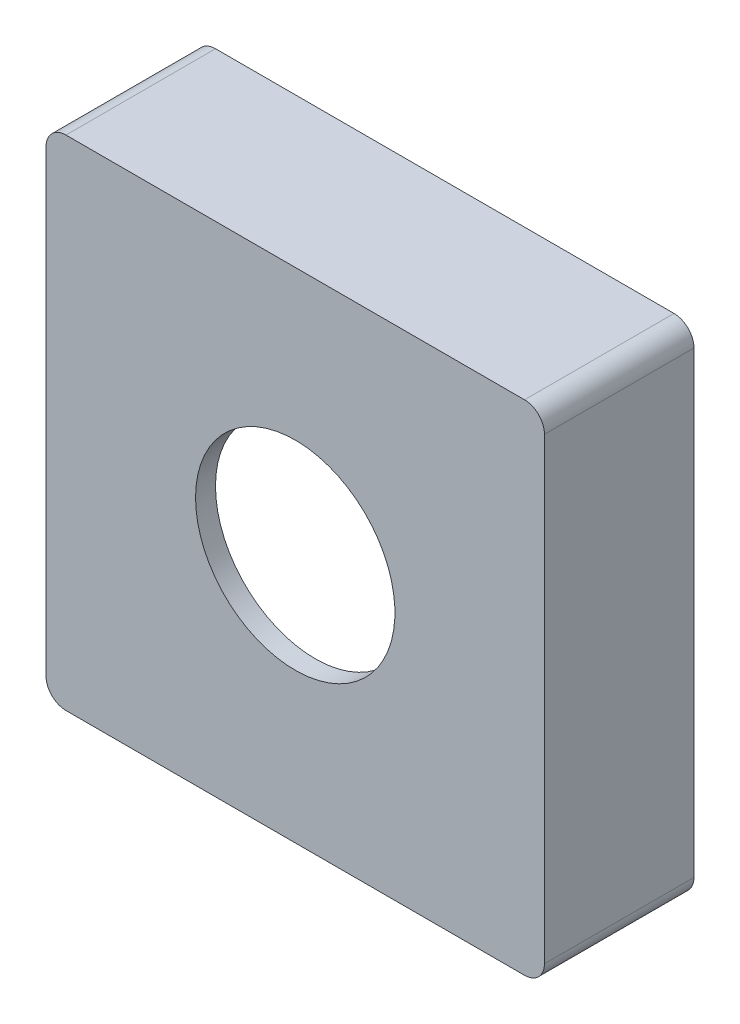
ISO-10303-21;
HEADER;
FILE_DESCRIPTION(('STEP AP214'),'2;1');
FILE_NAME('part.step','',(''),(''),'','','');
FILE_SCHEMA(('AUTOMOTIVE_DESIGN { 1 0 10303 214 1 1 1 1 }'));
ENDSEC;
DATA;
#1=APPLICATION_CONTEXT('core data for automotive mechanical design processes');
#2=APPLICATION_PROTOCOL_DEFINITION('international standard','automotive_design',2000,#1);
#3=PRODUCT_CONTEXT('',#1,'mechanical');
#4=PRODUCT('Part','Part','',(#3));
#5=PRODUCT_RELATED_PRODUCT_CATEGORY('part','',(#4));
#6=PRODUCT_DEFINITION_FORMATION('','',#4);
#7=PRODUCT_DEFINITION_CONTEXT('part definition',#1,'design');
#8=PRODUCT_DEFINITION('design','',#6,#7);
#9=PRODUCT_DEFINITION_SHAPE('','',#8);
#10=(LENGTH_UNIT() NAMED_UNIT(*) SI_UNIT(.MILLI.,.METRE.));
#11=(NAMED_UNIT(*) PLANE_ANGLE_UNIT() SI_UNIT($,.RADIAN.));
#12=(NAMED_UNIT(*) SI_UNIT($,.STERADIAN.) SOLID_ANGLE_UNIT());
#13=UNCERTAINTY_MEASURE_WITH_UNIT(LENGTH_MEASURE(1.E-05),#10,'distance_accuracy_value','');
#14=(GEOMETRIC_REPRESENTATION_CONTEXT(3) GLOBAL_UNCERTAINTY_ASSIGNED_CONTEXT((#13)) GLOBAL_UNIT_ASSIGNED_CONTEXT((#10,
#11,#12)) REPRESENTATION_CONTEXT('',''));
#15=CARTESIAN_POINT('',(0.,0.,0.));
#16=DIRECTION('',(0.,0.,1.));
#17=DIRECTION('',(1.,0.,0.));
#18=AXIS2_PLACEMENT_3D('',#15,#16,#17);
#19=CARTESIAN_POINT('',(0.,0.,0.));
#20=DIRECTION('',(0.,0.,-1.));
#21=DIRECTION('',(-1.,0.,0.));
#22=AXIS2_PLACEMENT_3D('',#19,#20,#21);
#23=PLANE('',#22);
#24=DIRECTION('',(1.,0.,0.));
#25=VECTOR('',#24,1.);
#26=CARTESIAN_POINT('',(25.,-25.,0.));
#27=LINE('',#26,#25);
#28=CARTESIAN_POINT('',(-23.,-25.,0.));
#29=VERTEX_POINT('',#28);
#30=CARTESIAN_POINT('',(23.,-25.,0.));
#31=VERTEX_POINT('',#30);
#32=EDGE_CURVE('E356',#29,#31,#27,.T.);
#33=ORIENTED_EDGE('',*,*,#32,.F.);
#34=CARTESIAN_POINT('',(-23.,-23.,0.));
#35=DIRECTION('',(0.,0.,-1.));
#36=DIRECTION('',(-1.,0.,0.));
#37=AXIS2_PLACEMENT_3D('',#34,#35,#36);
#38=CIRCLE('',#37,2.);
#39=CARTESIAN_POINT('',(-25.,-23.,0.));
#40=VERTEX_POINT('',#39);
#41=EDGE_CURVE('E229',#29,#40,#38,.T.);
#42=ORIENTED_EDGE('',*,*,#41,.T.);
#43=DIRECTION('',(0.,-1.,0.));
#44=VECTOR('',#43,1.);
#45=CARTESIAN_POINT('',(-25.,-25.,0.));
#46=LINE('',#45,#44);
#47=CARTESIAN_POINT('',(-25.,23.,0.));
#48=VERTEX_POINT('',#47);
#49=EDGE_CURVE('E362',#48,#40,#46,.T.);
#50=ORIENTED_EDGE('',*,*,#49,.F.);
#51=CARTESIAN_POINT('',(-23.,23.,0.));
#52=DIRECTION('',(0.,0.,-1.));
#53=DIRECTION('',(-1.,0.,0.));
#54=AXIS2_PLACEMENT_3D('',#51,#52,#53);
#55=CIRCLE('',#54,2.);
#56=CARTESIAN_POINT('',(-23.,25.,0.));
#57=VERTEX_POINT('',#56);
#58=EDGE_CURVE('E227',#48,#57,#55,.T.);
#59=ORIENTED_EDGE('',*,*,#58,.T.);
#60=DIRECTION('',(-1.,0.,0.));
#61=VECTOR('',#60,1.);
#62=CARTESIAN_POINT('',(25.,25.,0.));
#63=LINE('',#62,#61);
#64=CARTESIAN_POINT('',(23.,25.,0.));
#65=VERTEX_POINT('',#64);
#66=EDGE_CURVE('E360',#65,#57,#63,.T.);
#67=ORIENTED_EDGE('',*,*,#66,.F.);
#68=CARTESIAN_POINT('',(23.,23.,0.));
#69=DIRECTION('',(0.,0.,-1.));
#70=DIRECTION('',(-1.,0.,0.));
#71=AXIS2_PLACEMENT_3D('',#68,#69,#70);
#72=CIRCLE('',#71,2.);
#73=CARTESIAN_POINT('',(25.,23.,0.));
#74=VERTEX_POINT('',#73);
#75=EDGE_CURVE('E225',#65,#74,#72,.T.);
#76=ORIENTED_EDGE('',*,*,#75,.T.);
#77=DIRECTION('',(0.,1.,0.));
#78=VECTOR('',#77,1.);
#79=CARTESIAN_POINT('',(25.,-25.,0.));
#80=LINE('',#79,#78);
#81=CARTESIAN_POINT('',(25.,-23.,0.));
#82=VERTEX_POINT('',#81);
#83=EDGE_CURVE('E353',#82,#74,#80,.T.);
#84=ORIENTED_EDGE('',*,*,#83,.F.);
#85=CARTESIAN_POINT('',(23.,-23.,0.));
#86=DIRECTION('',(0.,0.,-1.));
#87=DIRECTION('',(-1.,0.,0.));
#88=AXIS2_PLACEMENT_3D('',#85,#86,#87);
#89=CIRCLE('',#88,2.);
#90=EDGE_CURVE('E223',#82,#31,#89,.T.);
#91=ORIENTED_EDGE('',*,*,#90,.T.);
#92=EDGE_LOOP('',(#33,#42,#50,#59,#67,#76,#84,#91));
#93=FACE_BOUND('',#92,.T.);
#94=DIRECTION('',(1.,0.,0.));
#95=VECTOR('',#94,1.);
#96=CARTESIAN_POINT('',(0.,-23.,0.));
#97=LINE('',#96,#95);
#98=CARTESIAN_POINT('',(-21.,-23.,0.));
#99=VERTEX_POINT('',#98);
#100=CARTESIAN_POINT('',(21.,-23.,0.));
#101=VERTEX_POINT('',#100);
#102=EDGE_CURVE('E179',#99,#101,#97,.T.);
#103=ORIENTED_EDGE('',*,*,#102,.T.);
#104=CARTESIAN_POINT('',(21.,-21.,0.));
#105=DIRECTION('',(0.,0.,-1.));
#106=DIRECTION('',(-1.,0.,0.));
#107=AXIS2_PLACEMENT_3D('',#104,#105,#106);
#108=CIRCLE('',#107,2.);
#109=CARTESIAN_POINT('',(23.,-21.,0.));
#110=VERTEX_POINT('',#109);
#111=EDGE_CURVE('E168',#101,#110,#108,.F.);
#112=ORIENTED_EDGE('',*,*,#111,.T.);
#113=DIRECTION('',(0.,1.,0.));
#114=VECTOR('',#113,1.);
#115=CARTESIAN_POINT('',(23.,0.,0.));
#116=LINE('',#115,#114);
#117=CARTESIAN_POINT('',(23.,21.,0.));
#118=VERTEX_POINT('',#117);
#119=EDGE_CURVE('E390',#110,#118,#116,.T.);
#120=ORIENTED_EDGE('',*,*,#119,.T.);
#121=CARTESIAN_POINT('',(21.,21.,0.));
#122=DIRECTION('',(0.,0.,-1.));
#123=DIRECTION('',(-1.,0.,0.));
#124=AXIS2_PLACEMENT_3D('',#121,#122,#123);
#125=CIRCLE('',#124,2.);
#126=CARTESIAN_POINT('',(21.,23.,0.));
#127=VERTEX_POINT('',#126);
#128=EDGE_CURVE('E216',#118,#127,#125,.F.);
#129=ORIENTED_EDGE('',*,*,#128,.T.);
#130=DIRECTION('',(-1.,0.,0.));
#131=VECTOR('',#130,1.);
#132=CARTESIAN_POINT('',(0.,23.,0.));
#133=LINE('',#132,#131);
#134=CARTESIAN_POINT('',(-21.,23.,0.));
#135=VERTEX_POINT('',#134);
#136=EDGE_CURVE('E163',#127,#135,#133,.T.);
#137=ORIENTED_EDGE('',*,*,#136,.T.);
#138=CARTESIAN_POINT('',(-21.,21.,0.));
#139=DIRECTION('',(0.,0.,-1.));
#140=DIRECTION('',(-1.,0.,0.));
#141=AXIS2_PLACEMENT_3D('',#138,#139,#140);
#142=CIRCLE('',#141,2.);
#143=CARTESIAN_POINT('',(-23.,21.,0.));
#144=VERTEX_POINT('',#143);
#145=EDGE_CURVE('E158',#135,#144,#142,.F.);
#146=ORIENTED_EDGE('',*,*,#145,.T.);
#147=DIRECTION('',(0.,-1.,0.));
#148=VECTOR('',#147,1.);
#149=CARTESIAN_POINT('',(-23.,0.,0.));
#150=LINE('',#149,#148);
#151=CARTESIAN_POINT('',(-23.,-21.,0.));
#152=VERTEX_POINT('',#151);
#153=EDGE_CURVE('E161',#144,#152,#150,.T.);
#154=ORIENTED_EDGE('',*,*,#153,.T.);
#155=CARTESIAN_POINT('',(-21.,-21.,0.));
#156=DIRECTION('',(0.,0.,-1.));
#157=DIRECTION('',(-1.,0.,0.));
#158=AXIS2_PLACEMENT_3D('',#155,#156,#157);
#159=CIRCLE('',#158,2.);
#160=EDGE_CURVE('E169',#152,#99,#159,.F.);
#161=ORIENTED_EDGE('',*,*,#160,.T.);
#162=EDGE_LOOP('',(#103,#112,#120,#129,#137,#146,#154,#161));
#163=FACE_BOUND('',#162,.T.);
#164=ADVANCED_FACE('F43',(#93,#163),#23,.T.);
#165=CARTESIAN_POINT('',(25.,25.,15.));
#166=DIRECTION('',(0.,-1.,0.));
#167=DIRECTION('',(0.,0.,-1.));
#168=AXIS2_PLACEMENT_3D('',#165,#166,#167);
#169=PLANE('',#168);
#170=ORIENTED_EDGE('',*,*,#66,.T.);
#171=DIRECTION('',(0.,0.,-1.));
#172=VECTOR('',#171,1.);
#173=CARTESIAN_POINT('',(-23.,25.,15.));
#174=LINE('',#173,#172);
#175=CARTESIAN_POINT('',(-23.,25.,15.));
#176=VERTEX_POINT('',#175);
#177=EDGE_CURVE('E246',#57,#176,#174,.F.);
#178=ORIENTED_EDGE('',*,*,#177,.T.);
#179=DIRECTION('',(-1.,0.,0.));
#180=VECTOR('',#179,1.);
#181=CARTESIAN_POINT('',(25.,25.,15.));
#182=LINE('',#181,#180);
#183=CARTESIAN_POINT('',(23.,25.,15.));
#184=VERTEX_POINT('',#183);
#185=EDGE_CURVE('E347',#184,#176,#182,.T.);
#186=ORIENTED_EDGE('',*,*,#185,.F.);
#187=DIRECTION('',(0.,0.,-1.));
#188=VECTOR('',#187,1.);
#189=CARTESIAN_POINT('',(23.,25.,15.));
#190=LINE('',#189,#188);
#191=EDGE_CURVE('E243',#184,#65,#190,.T.);
#192=ORIENTED_EDGE('',*,*,#191,.T.);
#193=EDGE_LOOP('',(#170,#178,#186,#192));
#194=FACE_BOUND('',#193,.T.);
#195=ADVANCED_FACE('F290',(#194),#169,.F.);
#196=CARTESIAN_POINT('',(-25.,-25.,15.));
#197=DIRECTION('',(1.,0.,0.));
#198=DIRECTION('',(0.,0.,-1.));
#199=AXIS2_PLACEMENT_3D('',#196,#197,#198);
#200=PLANE('',#199);
#201=ORIENTED_EDGE('',*,*,#49,.T.);
#202=DIRECTION('',(0.,0.,-1.));
#203=VECTOR('',#202,1.);
#204=CARTESIAN_POINT('',(-25.,-23.,15.));
#205=LINE('',#204,#203);
#206=CARTESIAN_POINT('',(-25.,-23.,15.));
#207=VERTEX_POINT('',#206);
#208=EDGE_CURVE('E234',#40,#207,#205,.F.);
#209=ORIENTED_EDGE('',*,*,#208,.T.);
#210=DIRECTION('',(0.,-1.,0.));
#211=VECTOR('',#210,1.);
#212=CARTESIAN_POINT('',(-25.,-25.,15.));
#213=LINE('',#212,#211);
#214=CARTESIAN_POINT('',(-25.,23.,15.));
#215=VERTEX_POINT('',#214);
#216=EDGE_CURVE('E352',#215,#207,#213,.T.);
#217=ORIENTED_EDGE('',*,*,#216,.F.);
#218=DIRECTION('',(0.,0.,-1.));
#219=VECTOR('',#218,1.);
#220=CARTESIAN_POINT('',(-25.,23.,15.));
#221=LINE('',#220,#219);
#222=EDGE_CURVE('E231',#215,#48,#221,.T.);
#223=ORIENTED_EDGE('',*,*,#222,.T.);
#224=EDGE_LOOP('',(#201,#209,#217,#223));
#225=FACE_BOUND('',#224,.T.);
#226=ADVANCED_FACE('F297',(#225),#200,.F.);
#227=CARTESIAN_POINT('',(25.,-25.,15.));
#228=DIRECTION('',(0.,1.,0.));
#229=DIRECTION('',(0.,0.,1.));
#230=AXIS2_PLACEMENT_3D('',#227,#228,#229);
#231=PLANE('',#230);
#232=DIRECTION('',(1.,0.,0.));
#233=VECTOR('',#232,1.);
#234=CARTESIAN_POINT('',(25.,-25.,15.));
#235=LINE('',#234,#233);
#236=CARTESIAN_POINT('',(-23.,-25.,15.));
#237=VERTEX_POINT('',#236);
#238=CARTESIAN_POINT('',(23.,-25.,15.));
#239=VERTEX_POINT('',#238);
#240=EDGE_CURVE('E188',#237,#239,#235,.T.);
#241=ORIENTED_EDGE('',*,*,#240,.F.);
#242=DIRECTION('',(0.,0.,-1.));
#243=VECTOR('',#242,1.);
#244=CARTESIAN_POINT('',(-23.,-25.,15.));
#245=LINE('',#244,#243);
#246=EDGE_CURVE('E220',#237,#29,#245,.T.);
#247=ORIENTED_EDGE('',*,*,#246,.T.);
#248=ORIENTED_EDGE('',*,*,#32,.T.);
#249=DIRECTION('',(0.,0.,-1.));
#250=VECTOR('',#249,1.);
#251=CARTESIAN_POINT('',(23.,-25.,15.));
#252=LINE('',#251,#250);
#253=EDGE_CURVE('E218',#31,#239,#252,.F.);
#254=ORIENTED_EDGE('',*,*,#253,.T.);
#255=EDGE_LOOP('',(#241,#247,#248,#254));
#256=FACE_BOUND('',#255,.T.);
#257=ADVANCED_FACE('F306',(#256),#231,.F.);
#258=CARTESIAN_POINT('',(25.,-25.,15.));
#259=DIRECTION('',(-1.,0.,0.));
#260=DIRECTION('',(0.,0.,1.));
#261=AXIS2_PLACEMENT_3D('',#258,#259,#260);
#262=PLANE('',#261);
#263=ORIENTED_EDGE('',*,*,#83,.T.);
#264=DIRECTION('',(0.,0.,-1.));
#265=VECTOR('',#264,1.);
#266=CARTESIAN_POINT('',(25.,23.,15.));
#267=LINE('',#266,#265);
#268=CARTESIAN_POINT('',(25.,23.,15.));
#269=VERTEX_POINT('',#268);
#270=EDGE_CURVE('E58',#74,#269,#267,.F.);
#271=ORIENTED_EDGE('',*,*,#270,.T.);
#272=DIRECTION('',(0.,1.,0.));
#273=VECTOR('',#272,1.);
#274=CARTESIAN_POINT('',(25.,-25.,15.));
#275=LINE('',#274,#273);
#276=CARTESIAN_POINT('',(25.,-23.,15.));
#277=VERTEX_POINT('',#276);
#278=EDGE_CURVE('E184',#277,#269,#275,.T.);
#279=ORIENTED_EDGE('',*,*,#278,.F.);
#280=DIRECTION('',(0.,0.,-1.));
#281=VECTOR('',#280,1.);
#282=CARTESIAN_POINT('',(25.,-23.,15.));
#283=LINE('',#282,#281);
#284=EDGE_CURVE('E248',#277,#82,#283,.T.);
#285=ORIENTED_EDGE('',*,*,#284,.T.);
#286=EDGE_LOOP('',(#263,#271,#279,#285));
#287=FACE_BOUND('',#286,.T.);
#288=ADVANCED_FACE('F303',(#287),#262,.F.);
#289=CARTESIAN_POINT('',(0.,0.,15.));
#290=DIRECTION('',(0.,0.,-1.));
#291=DIRECTION('',(-1.,0.,0.));
#292=AXIS2_PLACEMENT_3D('',#289,#290,#291);
#293=PLANE('',#292);
#294=CARTESIAN_POINT('',(0.,0.,15.));
#295=DIRECTION('',(0.,0.,-1.));
#296=DIRECTION('',(-1.,0.,0.));
#297=AXIS2_PLACEMENT_3D('',#294,#295,#296);
#298=CIRCLE('',#297,10.);
#299=CARTESIAN_POINT('',(-10.,0.,15.));
#300=VERTEX_POINT('',#299);
#301=EDGE_CURVE('E389',#300,#300,#298,.T.);
#302=ORIENTED_EDGE('',*,*,#301,.T.);
#303=EDGE_LOOP('',(#302));
#304=FACE_BOUND('',#303,.T.);
#305=ORIENTED_EDGE('',*,*,#216,.T.);
#306=CARTESIAN_POINT('',(-23.,-23.,15.));
#307=DIRECTION('',(0.,0.,-1.));
#308=DIRECTION('',(-1.,0.,0.));
#309=AXIS2_PLACEMENT_3D('',#306,#307,#308);
#310=CIRCLE('',#309,2.);
#311=EDGE_CURVE('E241',#207,#237,#310,.F.);
#312=ORIENTED_EDGE('',*,*,#311,.T.);
#313=ORIENTED_EDGE('',*,*,#240,.T.);
#314=CARTESIAN_POINT('',(23.,-23.,15.));
#315=DIRECTION('',(0.,0.,-1.));
#316=DIRECTION('',(-1.,0.,0.));
#317=AXIS2_PLACEMENT_3D('',#314,#315,#316);
#318=CIRCLE('',#317,2.);
#319=EDGE_CURVE('E65',#239,#277,#318,.F.);
#320=ORIENTED_EDGE('',*,*,#319,.T.);
#321=ORIENTED_EDGE('',*,*,#278,.T.);
#322=CARTESIAN_POINT('',(23.,23.,15.));
#323=DIRECTION('',(0.,0.,-1.));
#324=DIRECTION('',(-1.,0.,0.));
#325=AXIS2_PLACEMENT_3D('',#322,#323,#324);
#326=CIRCLE('',#325,2.);
#327=EDGE_CURVE('E237',#269,#184,#326,.F.);
#328=ORIENTED_EDGE('',*,*,#327,.T.);
#329=ORIENTED_EDGE('',*,*,#185,.T.);
#330=CARTESIAN_POINT('',(-23.,23.,15.));
#331=DIRECTION('',(0.,0.,-1.));
#332=DIRECTION('',(-1.,0.,0.));
#333=AXIS2_PLACEMENT_3D('',#330,#331,#332);
#334=CIRCLE('',#333,2.);
#335=EDGE_CURVE('E239',#176,#215,#334,.F.);
#336=ORIENTED_EDGE('',*,*,#335,.T.);
#337=EDGE_LOOP('',(#305,#312,#313,#320,#321,#328,#329,#336));
#338=FACE_BOUND('',#337,.T.);
#339=ADVANCED_FACE('F302',(#304,#338),#293,.F.);
#340=CARTESIAN_POINT('',(25.,23.,15.));
#341=DIRECTION('',(0.,-1.,0.));
#342=DIRECTION('',(0.,0.,-1.));
#343=AXIS2_PLACEMENT_3D('',#340,#341,#342);
#344=PLANE('',#343);
#345=DIRECTION('',(-1.,0.,0.));
#346=VECTOR('',#345,1.);
#347=CARTESIAN_POINT('',(0.,23.,13.));
#348=LINE('',#347,#346);
#349=CARTESIAN_POINT('',(21.,23.,13.));
#350=VERTEX_POINT('',#349);
#351=CARTESIAN_POINT('',(-21.,23.,13.));
#352=VERTEX_POINT('',#351);
#353=EDGE_CURVE('E392',#350,#352,#348,.T.);
#354=ORIENTED_EDGE('',*,*,#353,.T.);
#355=DIRECTION('',(0.,0.,-1.));
#356=VECTOR('',#355,1.);
#357=CARTESIAN_POINT('',(-21.,23.,0.));
#358=LINE('',#357,#356);
#359=EDGE_CURVE('E207',#352,#135,#358,.T.);
#360=ORIENTED_EDGE('',*,*,#359,.T.);
#361=ORIENTED_EDGE('',*,*,#136,.F.);
#362=DIRECTION('',(0.,0.,-1.));
#363=VECTOR('',#362,1.);
#364=CARTESIAN_POINT('',(21.,23.,13.));
#365=LINE('',#364,#363);
#366=EDGE_CURVE('E205',#127,#350,#365,.F.);
#367=ORIENTED_EDGE('',*,*,#366,.T.);
#368=EDGE_LOOP('',(#354,#360,#361,#367));
#369=FACE_BOUND('',#368,.T.);
#370=ADVANCED_FACE('F486',(#369),#344,.T.);
#371=CARTESIAN_POINT('',(-23.,-25.,15.));
#372=DIRECTION('',(1.,0.,0.));
#373=DIRECTION('',(0.,0.,-1.));
#374=AXIS2_PLACEMENT_3D('',#371,#372,#373);
#375=PLANE('',#374);
#376=DIRECTION('',(0.,-1.,0.));
#377=VECTOR('',#376,1.);
#378=CARTESIAN_POINT('',(-23.,0.,13.));
#379=LINE('',#378,#377);
#380=CARTESIAN_POINT('',(-23.,21.,13.));
#381=VERTEX_POINT('',#380);
#382=CARTESIAN_POINT('',(-23.,-21.,13.));
#383=VERTEX_POINT('',#382);
#384=EDGE_CURVE('E384',#381,#383,#379,.T.);
#385=ORIENTED_EDGE('',*,*,#384,.T.);
#386=DIRECTION('',(0.,0.,-1.));
#387=VECTOR('',#386,1.);
#388=CARTESIAN_POINT('',(-23.,-21.,0.));
#389=LINE('',#388,#387);
#390=EDGE_CURVE('E178',#383,#152,#389,.T.);
#391=ORIENTED_EDGE('',*,*,#390,.T.);
#392=ORIENTED_EDGE('',*,*,#153,.F.);
#393=DIRECTION('',(0.,0.,-1.));
#394=VECTOR('',#393,1.);
#395=CARTESIAN_POINT('',(-23.,21.,13.));
#396=LINE('',#395,#394);
#397=EDGE_CURVE('E175',#144,#381,#396,.F.);
#398=ORIENTED_EDGE('',*,*,#397,.T.);
#399=EDGE_LOOP('',(#385,#391,#392,#398));
#400=FACE_BOUND('',#399,.T.);
#401=ADVANCED_FACE('F174',(#400),#375,.T.);
#402=CARTESIAN_POINT('',(25.,-23.,15.));
#403=DIRECTION('',(0.,1.,0.));
#404=DIRECTION('',(0.,0.,1.));
#405=AXIS2_PLACEMENT_3D('',#402,#403,#404);
#406=PLANE('',#405);
#407=ORIENTED_EDGE('',*,*,#102,.F.);
#408=DIRECTION('',(0.,0.,-1.));
#409=VECTOR('',#408,1.);
#410=CARTESIAN_POINT('',(-21.,-23.,13.));
#411=LINE('',#410,#409);
#412=CARTESIAN_POINT('',(-21.,-23.,13.));
#413=VERTEX_POINT('',#412);
#414=EDGE_CURVE('E196',#99,#413,#411,.F.);
#415=ORIENTED_EDGE('',*,*,#414,.T.);
#416=DIRECTION('',(1.,0.,0.));
#417=VECTOR('',#416,1.);
#418=CARTESIAN_POINT('',(0.,-23.,13.));
#419=LINE('',#418,#417);
#420=CARTESIAN_POINT('',(21.,-23.,13.));
#421=VERTEX_POINT('',#420);
#422=EDGE_CURVE('E378',#413,#421,#419,.T.);
#423=ORIENTED_EDGE('',*,*,#422,.T.);
#424=DIRECTION('',(0.,0.,-1.));
#425=VECTOR('',#424,1.);
#426=CARTESIAN_POINT('',(21.,-23.,0.));
#427=LINE('',#426,#425);
#428=EDGE_CURVE('E186',#421,#101,#427,.T.);
#429=ORIENTED_EDGE('',*,*,#428,.T.);
#430=EDGE_LOOP('',(#407,#415,#423,#429));
#431=FACE_BOUND('',#430,.T.);
#432=ADVANCED_FACE('F397',(#431),#406,.T.);
#433=CARTESIAN_POINT('',(23.,-25.,15.));
#434=DIRECTION('',(-1.,0.,0.));
#435=DIRECTION('',(0.,0.,1.));
#436=AXIS2_PLACEMENT_3D('',#433,#434,#435);
#437=PLANE('',#436);
#438=ORIENTED_EDGE('',*,*,#119,.F.);
#439=DIRECTION('',(0.,0.,-1.));
#440=VECTOR('',#439,1.);
#441=CARTESIAN_POINT('',(23.,-21.,13.));
#442=LINE('',#441,#440);
#443=CARTESIAN_POINT('',(23.,-21.,13.));
#444=VERTEX_POINT('',#443);
#445=EDGE_CURVE('E212',#110,#444,#442,.F.);
#446=ORIENTED_EDGE('',*,*,#445,.T.);
#447=DIRECTION('',(0.,1.,0.));
#448=VECTOR('',#447,1.);
#449=CARTESIAN_POINT('',(23.,0.,13.));
#450=LINE('',#449,#448);
#451=CARTESIAN_POINT('',(23.,21.,13.));
#452=VERTEX_POINT('',#451);
#453=EDGE_CURVE('E363',#444,#452,#450,.T.);
#454=ORIENTED_EDGE('',*,*,#453,.T.);
#455=DIRECTION('',(0.,0.,-1.));
#456=VECTOR('',#455,1.);
#457=CARTESIAN_POINT('',(23.,21.,0.));
#458=LINE('',#457,#456);
#459=EDGE_CURVE('E209',#452,#118,#458,.T.);
#460=ORIENTED_EDGE('',*,*,#459,.T.);
#461=EDGE_LOOP('',(#438,#446,#454,#460));
#462=FACE_BOUND('',#461,.T.);
#463=ADVANCED_FACE('F493',(#462),#437,.T.);
#464=CARTESIAN_POINT('',(0.,0.,13.));
#465=DIRECTION('',(0.,0.,-1.));
#466=DIRECTION('',(-1.,0.,0.));
#467=AXIS2_PLACEMENT_3D('',#464,#465,#466);
#468=PLANE('',#467);
#469=CARTESIAN_POINT('',(-17.5,-10.,13.));
#470=DIRECTION('',(0.,0.,-1.));
#471=DIRECTION('',(-1.,0.,0.));
#472=AXIS2_PLACEMENT_3D('',#469,#470,#471);
#473=CIRCLE('',#472,2.5);
#474=CARTESIAN_POINT('',(-20.,-10.,13.));
#475=VERTEX_POINT('',#474);
#476=EDGE_CURVE('E436',#475,#475,#473,.T.);
#477=ORIENTED_EDGE('',*,*,#476,.F.);
#478=EDGE_LOOP('',(#477));
#479=FACE_BOUND('',#478,.T.);
#480=CARTESIAN_POINT('',(17.5,10.,13.));
#481=DIRECTION('',(0.,0.,-1.));
#482=DIRECTION('',(-1.,0.,0.));
#483=AXIS2_PLACEMENT_3D('',#480,#481,#482);
#484=CIRCLE('',#483,2.5);
#485=CARTESIAN_POINT('',(15.,10.,13.));
#486=VERTEX_POINT('',#485);
#487=EDGE_CURVE('E427',#486,#486,#484,.T.);
#488=ORIENTED_EDGE('',*,*,#487,.F.);
#489=EDGE_LOOP('',(#488));
#490=FACE_BOUND('',#489,.T.);
#491=CARTESIAN_POINT('',(-17.5,10.,13.));
#492=DIRECTION('',(0.,0.,-1.));
#493=DIRECTION('',(-1.,0.,0.));
#494=AXIS2_PLACEMENT_3D('',#491,#492,#493);
#495=CIRCLE('',#494,2.5);
#496=CARTESIAN_POINT('',(-20.,10.,13.));
#497=VERTEX_POINT('',#496);
#498=EDGE_CURVE('E417',#497,#497,#495,.T.);
#499=ORIENTED_EDGE('',*,*,#498,.F.);
#500=EDGE_LOOP('',(#499));
#501=FACE_BOUND('',#500,.T.);
#502=CARTESIAN_POINT('',(17.5,-10.,13.));
#503=DIRECTION('',(0.,0.,-1.));
#504=DIRECTION('',(-1.,0.,0.));
#505=AXIS2_PLACEMENT_3D('',#502,#503,#504);
#506=CIRCLE('',#505,2.5);
#507=CARTESIAN_POINT('',(15.,-10.,13.));
#508=VERTEX_POINT('',#507);
#509=EDGE_CURVE('E407',#508,#508,#506,.T.);
#510=ORIENTED_EDGE('',*,*,#509,.F.);
#511=EDGE_LOOP('',(#510));
#512=FACE_BOUND('',#511,.T.);
#513=CARTESIAN_POINT('',(0.,0.,13.));
#514=DIRECTION('',(0.,0.,-1.));
#515=DIRECTION('',(-1.,0.,0.));
#516=AXIS2_PLACEMENT_3D('',#513,#514,#515);
#517=CIRCLE('',#516,10.);
#518=CARTESIAN_POINT('',(-10.,0.,13.));
#519=VERTEX_POINT('',#518);
#520=EDGE_CURVE('E191',#519,#519,#517,.T.);
#521=ORIENTED_EDGE('',*,*,#520,.F.);
#522=EDGE_LOOP('',(#521));
#523=FACE_BOUND('',#522,.T.);
#524=ORIENTED_EDGE('',*,*,#422,.F.);
#525=CARTESIAN_POINT('',(-21.,-21.,13.));
#526=DIRECTION('',(0.,0.,-1.));
#527=DIRECTION('',(-1.,0.,0.));
#528=AXIS2_PLACEMENT_3D('',#525,#526,#527);
#529=CIRCLE('',#528,2.);
#530=EDGE_CURVE('E203',#413,#383,#529,.T.);
#531=ORIENTED_EDGE('',*,*,#530,.T.);
#532=ORIENTED_EDGE('',*,*,#384,.F.);
#533=CARTESIAN_POINT('',(-21.,21.,13.));
#534=DIRECTION('',(0.,0.,-1.));
#535=DIRECTION('',(-1.,0.,0.));
#536=AXIS2_PLACEMENT_3D('',#533,#534,#535);
#537=CIRCLE('',#536,2.);
#538=EDGE_CURVE('E183',#381,#352,#537,.T.);
#539=ORIENTED_EDGE('',*,*,#538,.T.);
#540=ORIENTED_EDGE('',*,*,#353,.F.);
#541=CARTESIAN_POINT('',(21.,21.,13.));
#542=DIRECTION('',(0.,0.,-1.));
#543=DIRECTION('',(-1.,0.,0.));
#544=AXIS2_PLACEMENT_3D('',#541,#542,#543);
#545=CIRCLE('',#544,2.);
#546=EDGE_CURVE('E198',#350,#452,#545,.T.);
#547=ORIENTED_EDGE('',*,*,#546,.T.);
#548=ORIENTED_EDGE('',*,*,#453,.F.);
#549=CARTESIAN_POINT('',(21.,-21.,13.));
#550=DIRECTION('',(0.,0.,-1.));
#551=DIRECTION('',(-1.,0.,0.));
#552=AXIS2_PLACEMENT_3D('',#549,#550,#551);
#553=CIRCLE('',#552,2.);
#554=EDGE_CURVE('E200',#444,#421,#553,.T.);
#555=ORIENTED_EDGE('',*,*,#554,.T.);
#556=EDGE_LOOP('',(#524,#531,#532,#539,#540,#547,#548,#555));
#557=FACE_BOUND('',#556,.T.);
#558=ADVANCED_FACE('F278',(#479,#490,#501,#512,#523,#557),#468,.T.);
#559=CARTESIAN_POINT('',(0.,0.,0.));
#560=DIRECTION('',(0.,0.,1.));
#561=DIRECTION('',(1.,0.,0.));
#562=AXIS2_PLACEMENT_3D('',#559,#560,#561);
#563=CYLINDRICAL_SURFACE('',#562,10.);
#564=ORIENTED_EDGE('',*,*,#520,.T.);
#565=EDGE_LOOP('',(#564));
#566=FACE_BOUND('',#565,.T.);
#567=ORIENTED_EDGE('',*,*,#301,.F.);
#568=EDGE_LOOP('',(#567));
#569=FACE_BOUND('',#568,.T.);
#570=ADVANCED_FACE('F316',(#566,#569),#563,.F.);
#571=CARTESIAN_POINT('',(-21.,-21.,15.));
#572=DIRECTION('',(0.,0.,1.));
#573=DIRECTION('',(1.,0.,0.));
#574=AXIS2_PLACEMENT_3D('',#571,#572,#573);
#575=CYLINDRICAL_SURFACE('',#574,2.);
#576=ORIENTED_EDGE('',*,*,#530,.F.);
#577=ORIENTED_EDGE('',*,*,#414,.F.);
#578=ORIENTED_EDGE('',*,*,#160,.F.);
#579=ORIENTED_EDGE('',*,*,#390,.F.);
#580=EDGE_LOOP('',(#576,#577,#578,#579));
#581=FACE_BOUND('',#580,.T.);
#582=ADVANCED_FACE('F313',(#581),#575,.F.);
#583=CARTESIAN_POINT('',(-21.,21.,15.));
#584=DIRECTION('',(0.,0.,1.));
#585=DIRECTION('',(1.,0.,0.));
#586=AXIS2_PLACEMENT_3D('',#583,#584,#585);
#587=CYLINDRICAL_SURFACE('',#586,2.);
#588=ORIENTED_EDGE('',*,*,#538,.F.);
#589=ORIENTED_EDGE('',*,*,#397,.F.);
#590=ORIENTED_EDGE('',*,*,#145,.F.);
#591=ORIENTED_EDGE('',*,*,#359,.F.);
#592=EDGE_LOOP('',(#588,#589,#590,#591));
#593=FACE_BOUND('',#592,.T.);
#594=ADVANCED_FACE('F182',(#593),#587,.F.);
#595=CARTESIAN_POINT('',(21.,-21.,15.));
#596=DIRECTION('',(0.,0.,1.));
#597=DIRECTION('',(1.,0.,0.));
#598=AXIS2_PLACEMENT_3D('',#595,#596,#597);
#599=CYLINDRICAL_SURFACE('',#598,2.);
#600=ORIENTED_EDGE('',*,*,#554,.F.);
#601=ORIENTED_EDGE('',*,*,#445,.F.);
#602=ORIENTED_EDGE('',*,*,#111,.F.);
#603=ORIENTED_EDGE('',*,*,#428,.F.);
#604=EDGE_LOOP('',(#600,#601,#602,#603));
#605=FACE_BOUND('',#604,.T.);
#606=ADVANCED_FACE('F320',(#605),#599,.F.);
#607=CARTESIAN_POINT('',(21.,21.,15.));
#608=DIRECTION('',(0.,0.,1.));
#609=DIRECTION('',(1.,0.,0.));
#610=AXIS2_PLACEMENT_3D('',#607,#608,#609);
#611=CYLINDRICAL_SURFACE('',#610,2.);
#612=ORIENTED_EDGE('',*,*,#546,.F.);
#613=ORIENTED_EDGE('',*,*,#366,.F.);
#614=ORIENTED_EDGE('',*,*,#128,.F.);
#615=ORIENTED_EDGE('',*,*,#459,.F.);
#616=EDGE_LOOP('',(#612,#613,#614,#615));
#617=FACE_BOUND('',#616,.T.);
#618=ADVANCED_FACE('F323',(#617),#611,.F.);
#619=CARTESIAN_POINT('',(-23.,-23.,15.));
#620=DIRECTION('',(0.,0.,-1.));
#621=DIRECTION('',(-1.,0.,0.));
#622=AXIS2_PLACEMENT_3D('',#619,#620,#621);
#623=CYLINDRICAL_SURFACE('',#622,2.);
#624=ORIENTED_EDGE('',*,*,#311,.F.);
#625=ORIENTED_EDGE('',*,*,#208,.F.);
#626=ORIENTED_EDGE('',*,*,#41,.F.);
#627=ORIENTED_EDGE('',*,*,#246,.F.);
#628=EDGE_LOOP('',(#624,#625,#626,#627));
#629=FACE_BOUND('',#628,.T.);
#630=ADVANCED_FACE('F326',(#629),#623,.T.);
#631=CARTESIAN_POINT('',(-23.,23.,15.));
#632=DIRECTION('',(0.,0.,-1.));
#633=DIRECTION('',(-1.,0.,0.));
#634=AXIS2_PLACEMENT_3D('',#631,#632,#633);
#635=CYLINDRICAL_SURFACE('',#634,2.);
#636=ORIENTED_EDGE('',*,*,#335,.F.);
#637=ORIENTED_EDGE('',*,*,#177,.F.);
#638=ORIENTED_EDGE('',*,*,#58,.F.);
#639=ORIENTED_EDGE('',*,*,#222,.F.);
#640=EDGE_LOOP('',(#636,#637,#638,#639));
#641=FACE_BOUND('',#640,.T.);
#642=ADVANCED_FACE('F330',(#641),#635,.T.);
#643=CARTESIAN_POINT('',(23.,23.,15.));
#644=DIRECTION('',(0.,0.,-1.));
#645=DIRECTION('',(-1.,0.,0.));
#646=AXIS2_PLACEMENT_3D('',#643,#644,#645);
#647=CYLINDRICAL_SURFACE('',#646,2.);
#648=ORIENTED_EDGE('',*,*,#327,.F.);
#649=ORIENTED_EDGE('',*,*,#270,.F.);
#650=ORIENTED_EDGE('',*,*,#75,.F.);
#651=ORIENTED_EDGE('',*,*,#191,.F.);
#652=EDGE_LOOP('',(#648,#649,#650,#651));
#653=FACE_BOUND('',#652,.T.);
#654=ADVANCED_FACE('F333',(#653),#647,.T.);
#655=CARTESIAN_POINT('',(23.,-23.,15.));
#656=DIRECTION('',(0.,0.,-1.));
#657=DIRECTION('',(-1.,0.,0.));
#658=AXIS2_PLACEMENT_3D('',#655,#656,#657);
#659=CYLINDRICAL_SURFACE('',#658,2.);
#660=ORIENTED_EDGE('',*,*,#319,.F.);
#661=ORIENTED_EDGE('',*,*,#253,.F.);
#662=ORIENTED_EDGE('',*,*,#90,.F.);
#663=ORIENTED_EDGE('',*,*,#284,.F.);
#664=EDGE_LOOP('',(#660,#661,#662,#663));
#665=FACE_BOUND('',#664,.T.);
#666=ADVANCED_FACE('F45',(#665),#659,.T.);
#667=CARTESIAN_POINT('',(17.5,-10.,10.));
#668=DIRECTION('',(0.,0.,-1.));
#669=DIRECTION('',(-1.,0.,0.));
#670=AXIS2_PLACEMENT_3D('',#667,#668,#669);
#671=PLANE('',#670);
#672=CARTESIAN_POINT('',(17.5,-10.,10.));
#673=DIRECTION('',(0.,0.,-1.));
#674=DIRECTION('',(-1.,0.,0.));
#675=AXIS2_PLACEMENT_3D('',#672,#673,#674);
#676=CIRCLE('',#675,2.5);
#677=CARTESIAN_POINT('',(15.,-10.,10.));
#678=VERTEX_POINT('',#677);
#679=EDGE_CURVE('E410',#678,#678,#676,.T.);
#680=ORIENTED_EDGE('',*,*,#679,.T.);
#681=EDGE_LOOP('',(#680));
#682=FACE_BOUND('',#681,.T.);
#683=CARTESIAN_POINT('',(17.5,-10.,10.));
#684=DIRECTION('',(0.,0.,-1.));
#685=DIRECTION('',(-1.,0.,0.));
#686=AXIS2_PLACEMENT_3D('',#683,#684,#685);
#687=CIRCLE('',#686,1.5);
#688=CARTESIAN_POINT('',(16.,-10.,10.));
#689=VERTEX_POINT('',#688);
#690=EDGE_CURVE('E411',#689,#689,#687,.T.);
#691=ORIENTED_EDGE('',*,*,#690,.F.);
#692=EDGE_LOOP('',(#691));
#693=FACE_BOUND('',#692,.T.);
#694=ADVANCED_FACE('F340',(#682,#693),#671,.T.);
#695=CARTESIAN_POINT('',(17.5,-10.,10.));
#696=DIRECTION('',(0.,0.,1.));
#697=DIRECTION('',(1.,0.,0.));
#698=AXIS2_PLACEMENT_3D('',#695,#696,#697);
#699=CYLINDRICAL_SURFACE('',#698,2.5);
#700=ORIENTED_EDGE('',*,*,#679,.F.);
#701=EDGE_LOOP('',(#700));
#702=FACE_BOUND('',#701,.T.);
#703=ORIENTED_EDGE('',*,*,#509,.T.);
#704=EDGE_LOOP('',(#703));
#705=FACE_BOUND('',#704,.T.);
#706=ADVANCED_FACE('F475',(#702,#705),#699,.T.);
#707=CARTESIAN_POINT('',(17.5,-10.,10.));
#708=DIRECTION('',(0.,0.,1.));
#709=DIRECTION('',(1.,0.,0.));
#710=AXIS2_PLACEMENT_3D('',#707,#708,#709);
#711=CYLINDRICAL_SURFACE('',#710,1.5);
#712=ORIENTED_EDGE('',*,*,#690,.T.);
#713=EDGE_LOOP('',(#712));
#714=FACE_BOUND('',#713,.T.);
#715=CARTESIAN_POINT('',(17.5,-10.,13.));
#716=DIRECTION('',(0.,0.,-1.));
#717=DIRECTION('',(-1.,0.,0.));
#718=AXIS2_PLACEMENT_3D('',#715,#716,#717);
#719=CIRCLE('',#718,1.5);
#720=CARTESIAN_POINT('',(16.,-10.,13.));
#721=VERTEX_POINT('',#720);
#722=EDGE_CURVE('E252',#721,#721,#719,.F.);
#723=ORIENTED_EDGE('',*,*,#722,.T.);
#724=EDGE_LOOP('',(#723));
#725=FACE_BOUND('',#724,.T.);
#726=ADVANCED_FACE('F472',(#714,#725),#711,.F.);
#727=ORIENTED_EDGE('',*,*,#722,.F.);
#728=EDGE_LOOP('',(#727));
#729=FACE_BOUND('',#728,.T.);
#730=ADVANCED_FACE('F285',(#729),#468,.T.);
#731=CARTESIAN_POINT('',(-17.5,10.,10.));
#732=DIRECTION('',(0.,0.,-1.));
#733=DIRECTION('',(-1.,0.,0.));
#734=AXIS2_PLACEMENT_3D('',#731,#732,#733);
#735=PLANE('',#734);
#736=CARTESIAN_POINT('',(-17.5,10.,10.));
#737=DIRECTION('',(0.,0.,-1.));
#738=DIRECTION('',(-1.,0.,0.));
#739=AXIS2_PLACEMENT_3D('',#736,#737,#738);
#740=CIRCLE('',#739,2.5);
#741=CARTESIAN_POINT('',(-20.,10.,10.));
#742=VERTEX_POINT('',#741);
#743=EDGE_CURVE('E420',#742,#742,#740,.T.);
#744=ORIENTED_EDGE('',*,*,#743,.T.);
#745=EDGE_LOOP('',(#744));
#746=FACE_BOUND('',#745,.T.);
#747=CARTESIAN_POINT('',(-17.5,10.,10.));
#748=DIRECTION('',(0.,0.,-1.));
#749=DIRECTION('',(-1.,0.,0.));
#750=AXIS2_PLACEMENT_3D('',#747,#748,#749);
#751=CIRCLE('',#750,1.5);
#752=CARTESIAN_POINT('',(-19.,10.,10.));
#753=VERTEX_POINT('',#752);
#754=EDGE_CURVE('E421',#753,#753,#751,.T.);
#755=ORIENTED_EDGE('',*,*,#754,.F.);
#756=EDGE_LOOP('',(#755));
#757=FACE_BOUND('',#756,.T.);
#758=ADVANCED_FACE('F465',(#746,#757),#735,.T.);
#759=CARTESIAN_POINT('',(-17.5,10.,10.));
#760=DIRECTION('',(0.,0.,1.));
#761=DIRECTION('',(1.,0.,0.));
#762=AXIS2_PLACEMENT_3D('',#759,#760,#761);
#763=CYLINDRICAL_SURFACE('',#762,2.5);
#764=ORIENTED_EDGE('',*,*,#743,.F.);
#765=EDGE_LOOP('',(#764));
#766=FACE_BOUND('',#765,.T.);
#767=ORIENTED_EDGE('',*,*,#498,.T.);
#768=EDGE_LOOP('',(#767));
#769=FACE_BOUND('',#768,.T.);
#770=ADVANCED_FACE('F463',(#766,#769),#763,.T.);
#771=CARTESIAN_POINT('',(-17.5,10.,10.));
#772=DIRECTION('',(0.,0.,1.));
#773=DIRECTION('',(1.,0.,0.));
#774=AXIS2_PLACEMENT_3D('',#771,#772,#773);
#775=CYLINDRICAL_SURFACE('',#774,1.5);
#776=ORIENTED_EDGE('',*,*,#754,.T.);
#777=EDGE_LOOP('',(#776));
#778=FACE_BOUND('',#777,.T.);
#779=CARTESIAN_POINT('',(-17.5,10.,13.));
#780=DIRECTION('',(0.,0.,-1.));
#781=DIRECTION('',(-1.,0.,0.));
#782=AXIS2_PLACEMENT_3D('',#779,#780,#781);
#783=CIRCLE('',#782,1.5);
#784=CARTESIAN_POINT('',(-19.,10.,13.));
#785=VERTEX_POINT('',#784);
#786=EDGE_CURVE('E255',#785,#785,#783,.F.);
#787=ORIENTED_EDGE('',*,*,#786,.T.);
#788=EDGE_LOOP('',(#787));
#789=FACE_BOUND('',#788,.T.);
#790=ADVANCED_FACE('F283',(#778,#789),#775,.F.);
#791=ORIENTED_EDGE('',*,*,#786,.F.);
#792=EDGE_LOOP('',(#791));
#793=FACE_BOUND('',#792,.T.);
#794=ADVANCED_FACE('F266',(#793),#468,.T.);
#795=CARTESIAN_POINT('',(17.5,10.,10.));
#796=DIRECTION('',(0.,0.,-1.));
#797=DIRECTION('',(-1.,0.,0.));
#798=AXIS2_PLACEMENT_3D('',#795,#796,#797);
#799=PLANE('',#798);
#800=CARTESIAN_POINT('',(17.5,10.,10.));
#801=DIRECTION('',(0.,0.,-1.));
#802=DIRECTION('',(-1.,0.,0.));
#803=AXIS2_PLACEMENT_3D('',#800,#801,#802);
#804=CIRCLE('',#803,2.5);
#805=CARTESIAN_POINT('',(15.,10.,10.));
#806=VERTEX_POINT('',#805);
#807=EDGE_CURVE('E430',#806,#806,#804,.T.);
#808=ORIENTED_EDGE('',*,*,#807,.T.);
#809=EDGE_LOOP('',(#808));
#810=FACE_BOUND('',#809,.T.);
#811=CARTESIAN_POINT('',(17.5,10.,10.));
#812=DIRECTION('',(0.,0.,-1.));
#813=DIRECTION('',(-1.,0.,0.));
#814=AXIS2_PLACEMENT_3D('',#811,#812,#813);
#815=CIRCLE('',#814,1.5);
#816=CARTESIAN_POINT('',(16.,10.,10.));
#817=VERTEX_POINT('',#816);
#818=EDGE_CURVE('E424',#817,#817,#815,.T.);
#819=ORIENTED_EDGE('',*,*,#818,.F.);
#820=EDGE_LOOP('',(#819));
#821=FACE_BOUND('',#820,.T.);
#822=ADVANCED_FACE('F282',(#810,#821),#799,.T.);
#823=CARTESIAN_POINT('',(17.5,10.,10.));
#824=DIRECTION('',(0.,0.,1.));
#825=DIRECTION('',(1.,0.,0.));
#826=AXIS2_PLACEMENT_3D('',#823,#824,#825);
#827=CYLINDRICAL_SURFACE('',#826,2.5);
#828=ORIENTED_EDGE('',*,*,#807,.F.);
#829=EDGE_LOOP('',(#828));
#830=FACE_BOUND('',#829,.T.);
#831=ORIENTED_EDGE('',*,*,#487,.T.);
#832=EDGE_LOOP('',(#831));
#833=FACE_BOUND('',#832,.T.);
#834=ADVANCED_FACE('F275',(#830,#833),#827,.T.);
#835=CARTESIAN_POINT('',(17.5,10.,10.));
#836=DIRECTION('',(0.,0.,1.));
#837=DIRECTION('',(1.,0.,0.));
#838=AXIS2_PLACEMENT_3D('',#835,#836,#837);
#839=CYLINDRICAL_SURFACE('',#838,1.5);
#840=ORIENTED_EDGE('',*,*,#818,.T.);
#841=EDGE_LOOP('',(#840));
#842=FACE_BOUND('',#841,.T.);
#843=CARTESIAN_POINT('',(17.5,10.,13.));
#844=DIRECTION('',(0.,0.,-1.));
#845=DIRECTION('',(-1.,0.,0.));
#846=AXIS2_PLACEMENT_3D('',#843,#844,#845);
#847=CIRCLE('',#846,1.5);
#848=CARTESIAN_POINT('',(16.,10.,13.));
#849=VERTEX_POINT('',#848);
#850=EDGE_CURVE('E51',#849,#849,#847,.F.);
#851=ORIENTED_EDGE('',*,*,#850,.T.);
#852=EDGE_LOOP('',(#851));
#853=FACE_BOUND('',#852,.T.);
#854=ADVANCED_FACE('F260',(#842,#853),#839,.F.);
#855=ORIENTED_EDGE('',*,*,#850,.F.);
#856=EDGE_LOOP('',(#855));
#857=FACE_BOUND('',#856,.T.);
#858=ADVANCED_FACE('F262',(#857),#468,.T.);
#859=CARTESIAN_POINT('',(-17.5,-10.,10.));
#860=DIRECTION('',(0.,0.,-1.));
#861=DIRECTION('',(-1.,0.,0.));
#862=AXIS2_PLACEMENT_3D('',#859,#860,#861);
#863=PLANE('',#862);
#864=CARTESIAN_POINT('',(-17.5,-10.,10.));
#865=DIRECTION('',(0.,0.,-1.));
#866=DIRECTION('',(-1.,0.,0.));
#867=AXIS2_PLACEMENT_3D('',#864,#865,#866);
#868=CIRCLE('',#867,2.5);
#869=CARTESIAN_POINT('',(-20.,-10.,10.));
#870=VERTEX_POINT('',#869);
#871=EDGE_CURVE('E416',#870,#870,#868,.T.);
#872=ORIENTED_EDGE('',*,*,#871,.T.);
#873=EDGE_LOOP('',(#872));
#874=FACE_BOUND('',#873,.T.);
#875=CARTESIAN_POINT('',(-17.5,-10.,10.));
#876=DIRECTION('',(0.,0.,-1.));
#877=DIRECTION('',(-1.,0.,0.));
#878=AXIS2_PLACEMENT_3D('',#875,#876,#877);
#879=CIRCLE('',#878,1.5);
#880=CARTESIAN_POINT('',(-19.,-10.,10.));
#881=VERTEX_POINT('',#880);
#882=EDGE_CURVE('E433',#881,#881,#879,.T.);
#883=ORIENTED_EDGE('',*,*,#882,.F.);
#884=EDGE_LOOP('',(#883));
#885=FACE_BOUND('',#884,.T.);
#886=ADVANCED_FACE('F264',(#874,#885),#863,.T.);
#887=CARTESIAN_POINT('',(-17.5,-10.,10.));
#888=DIRECTION('',(0.,0.,1.));
#889=DIRECTION('',(1.,0.,0.));
#890=AXIS2_PLACEMENT_3D('',#887,#888,#889);
#891=CYLINDRICAL_SURFACE('',#890,2.5);
#892=ORIENTED_EDGE('',*,*,#871,.F.);
#893=EDGE_LOOP('',(#892));
#894=FACE_BOUND('',#893,.T.);
#895=ORIENTED_EDGE('',*,*,#476,.T.);
#896=EDGE_LOOP('',(#895));
#897=FACE_BOUND('',#896,.T.);
#898=ADVANCED_FACE('F272',(#894,#897),#891,.T.);
#899=CARTESIAN_POINT('',(-17.5,-10.,10.));
#900=DIRECTION('',(0.,0.,1.));
#901=DIRECTION('',(1.,0.,0.));
#902=AXIS2_PLACEMENT_3D('',#899,#900,#901);
#903=CYLINDRICAL_SURFACE('',#902,1.5);
#904=ORIENTED_EDGE('',*,*,#882,.T.);
#905=EDGE_LOOP('',(#904));
#906=FACE_BOUND('',#905,.T.);
#907=CARTESIAN_POINT('',(-17.5,-10.,13.));
#908=DIRECTION('',(0.,0.,-1.));
#909=DIRECTION('',(-1.,0.,0.));
#910=AXIS2_PLACEMENT_3D('',#907,#908,#909);
#911=CIRCLE('',#910,1.5);
#912=CARTESIAN_POINT('',(-19.,-10.,13.));
#913=VERTEX_POINT('',#912);
#914=EDGE_CURVE('E11',#913,#913,#911,.F.);
#915=ORIENTED_EDGE('',*,*,#914,.T.);
#916=EDGE_LOOP('',(#915));
#917=FACE_BOUND('',#916,.T.);
#918=ADVANCED_FACE('F287',(#906,#917),#903,.F.);
#919=ORIENTED_EDGE('',*,*,#914,.F.);
#920=EDGE_LOOP('',(#919));
#921=FACE_BOUND('',#920,.T.);
#922=ADVANCED_FACE('F267',(#921),#468,.T.);
#923=CLOSED_SHELL('',(#164,#195,#226,#257,#288,#339,#370,#401,#432,#463,#558,#570,#582,#594,
#606,#618,#630,#642,#654,#666,#694,#706,#726,#730,#758,#770,#790,#794,#822,#834,#854,#858,#886,
#898,#918,#922));
#924=MANIFOLD_SOLID_BREP('B2',#923);
#925=ADVANCED_BREP_SHAPE_REPRESENTATION('',(#18,#924),#14);
#926=SHAPE_DEFINITION_REPRESENTATION(#9,#925);
ENDSEC;
END-ISO-10303-21;
